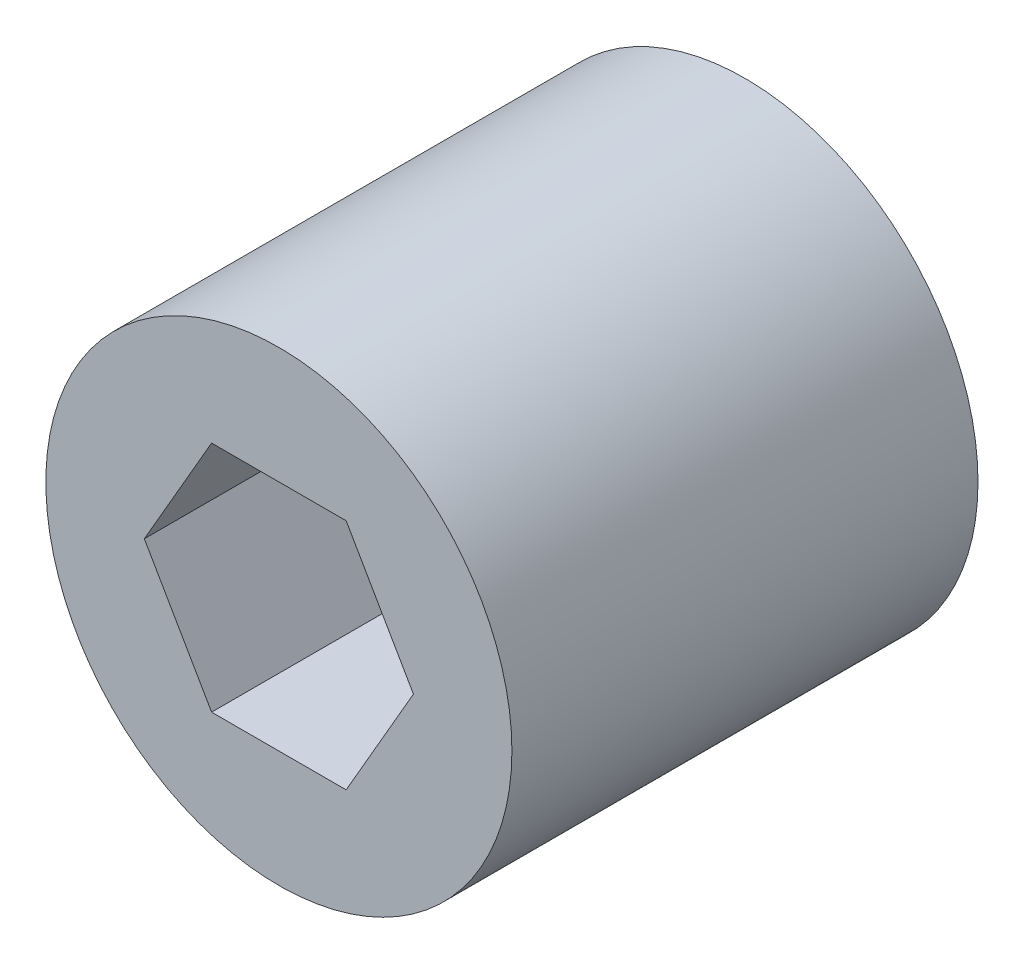
ISO-10303-21;
HEADER;
FILE_DESCRIPTION(('STEP AP214'),'2;1');
FILE_NAME('part.step','',(''),(''),'','','');
FILE_SCHEMA(('AUTOMOTIVE_DESIGN { 1 0 10303 214 1 1 1 1 }'));
ENDSEC;
DATA;
#1=APPLICATION_CONTEXT('core data for automotive mechanical design processes');
#2=APPLICATION_PROTOCOL_DEFINITION('international standard','automotive_design',2000,#1);
#3=PRODUCT_CONTEXT('',#1,'mechanical');
#4=PRODUCT('Part','Part','',(#3));
#5=PRODUCT_RELATED_PRODUCT_CATEGORY('part','',(#4));
#6=PRODUCT_DEFINITION_FORMATION('','',#4);
#7=PRODUCT_DEFINITION_CONTEXT('part definition',#1,'design');
#8=PRODUCT_DEFINITION('design','',#6,#7);
#9=PRODUCT_DEFINITION_SHAPE('','',#8);
#10=(LENGTH_UNIT() NAMED_UNIT(*) SI_UNIT(.MILLI.,.METRE.));
#11=(NAMED_UNIT(*) PLANE_ANGLE_UNIT() SI_UNIT($,.RADIAN.));
#12=(NAMED_UNIT(*) SI_UNIT($,.STERADIAN.) SOLID_ANGLE_UNIT());
#13=UNCERTAINTY_MEASURE_WITH_UNIT(LENGTH_MEASURE(1.E-05),#10,'distance_accuracy_value','');
#14=(GEOMETRIC_REPRESENTATION_CONTEXT(3) GLOBAL_UNCERTAINTY_ASSIGNED_CONTEXT((#13)) GLOBAL_UNIT_ASSIGNED_CONTEXT((#10,
#11,#12)) REPRESENTATION_CONTEXT('',''));
#15=CARTESIAN_POINT('',(0.,0.,0.));
#16=DIRECTION('',(0.,0.,1.));
#17=DIRECTION('',(1.,0.,0.));
#18=AXIS2_PLACEMENT_3D('',#15,#16,#17);
#19=CARTESIAN_POINT('',(0.,0.,25.4));
#20=DIRECTION('',(0.,0.,1.));
#21=DIRECTION('',(1.,0.,0.));
#22=AXIS2_PLACEMENT_3D('',#19,#20,#21);
#23=PLANE('',#22);
#24=CARTESIAN_POINT('',(0.,0.,25.4));
#25=DIRECTION('',(0.,0.,1.));
#26=DIRECTION('',(1.,0.,0.));
#27=AXIS2_PLACEMENT_3D('',#24,#25,#26);
#28=CIRCLE('',#27,12.7);
#29=CARTESIAN_POINT('',(12.7,0.,25.4));
#30=VERTEX_POINT('',#29);
#31=EDGE_CURVE('E11',#30,#30,#28,.T.);
#32=ORIENTED_EDGE('',*,*,#31,.T.);
#33=EDGE_LOOP('',(#32));
#34=FACE_BOUND('',#33,.T.);
#35=DIRECTION('',(0.500000000000001,-0.866025403784438,0.));
#36=VECTOR('',#35,1.);
#37=CARTESIAN_POINT('',(-7.33234841870825,0.,25.4));
#38=LINE('',#37,#36);
#39=CARTESIAN_POINT('',(-7.33234841870825,0.,25.4));
#40=VERTEX_POINT('',#39);
#41=CARTESIAN_POINT('',(-3.66617420935411,-6.35000000000001,25.4));
#42=VERTEX_POINT('',#41);
#43=EDGE_CURVE('E93',#40,#42,#38,.T.);
#44=ORIENTED_EDGE('',*,*,#43,.F.);
#45=DIRECTION('',(-0.499999999999995,-0.866025403784442,0.));
#46=VECTOR('',#45,1.);
#47=CARTESIAN_POINT('',(-3.6661742093542,6.34999999999996,25.4));
#48=LINE('',#47,#46);
#49=CARTESIAN_POINT('',(-3.6661742093542,6.34999999999996,25.4));
#50=VERTEX_POINT('',#49);
#51=EDGE_CURVE('E85',#50,#40,#48,.T.);
#52=ORIENTED_EDGE('',*,*,#51,.F.);
#53=DIRECTION('',(-1.,0.,0.));
#54=VECTOR('',#53,1.);
#55=CARTESIAN_POINT('',(3.66617420935407,6.35000000000004,25.4));
#56=LINE('',#55,#54);
#57=CARTESIAN_POINT('',(3.66617420935407,6.35000000000004,25.4));
#58=VERTEX_POINT('',#57);
#59=EDGE_CURVE('E113',#58,#50,#56,.T.);
#60=ORIENTED_EDGE('',*,*,#59,.F.);
#61=DIRECTION('',(-0.500000000000007,0.866025403784435,0.));
#62=VECTOR('',#61,1.);
#63=CARTESIAN_POINT('',(7.33234841870825,0.,25.4));
#64=LINE('',#63,#62);
#65=CARTESIAN_POINT('',(7.33234841870825,0.,25.4));
#66=VERTEX_POINT('',#65);
#67=EDGE_CURVE('E111',#66,#58,#64,.T.);
#68=ORIENTED_EDGE('',*,*,#67,.F.);
#69=DIRECTION('',(0.499999999999995,0.866025403784442,0.));
#70=VECTOR('',#69,1.);
#71=CARTESIAN_POINT('',(3.66617420935416,-6.34999999999999,25.4));
#72=LINE('',#71,#70);
#73=CARTESIAN_POINT('',(3.66617420935416,-6.34999999999999,25.4));
#74=VERTEX_POINT('',#73);
#75=EDGE_CURVE('E107',#74,#66,#72,.T.);
#76=ORIENTED_EDGE('',*,*,#75,.F.);
#77=DIRECTION('',(1.,0.,0.));
#78=VECTOR('',#77,1.);
#79=CARTESIAN_POINT('',(-3.66617420935411,-6.35000000000001,25.4));
#80=LINE('',#79,#78);
#81=EDGE_CURVE('E105',#42,#74,#80,.T.);
#82=ORIENTED_EDGE('',*,*,#81,.F.);
#83=EDGE_LOOP('',(#44,#52,#60,#68,#76,#82));
#84=FACE_BOUND('',#83,.T.);
#85=ADVANCED_FACE('F32',(#34,#84),#23,.T.);
#86=CARTESIAN_POINT('',(0.,0.,0.));
#87=DIRECTION('',(0.,0.,1.));
#88=DIRECTION('',(1.,0.,0.));
#89=AXIS2_PLACEMENT_3D('',#86,#87,#88);
#90=PLANE('',#89);
#91=CARTESIAN_POINT('',(0.,0.,0.));
#92=DIRECTION('',(0.,0.,1.));
#93=DIRECTION('',(1.,0.,0.));
#94=AXIS2_PLACEMENT_3D('',#91,#92,#93);
#95=CIRCLE('',#94,12.7);
#96=CARTESIAN_POINT('',(12.7,0.,0.));
#97=VERTEX_POINT('',#96);
#98=EDGE_CURVE('E36',#97,#97,#95,.T.);
#99=ORIENTED_EDGE('',*,*,#98,.F.);
#100=EDGE_LOOP('',(#99));
#101=FACE_BOUND('',#100,.T.);
#102=DIRECTION('',(-0.499999999999995,-0.866025403784442,0.));
#103=VECTOR('',#102,1.);
#104=CARTESIAN_POINT('',(-3.6661742093542,6.34999999999996,0.));
#105=LINE('',#104,#103);
#106=CARTESIAN_POINT('',(-3.6661742093542,6.34999999999996,0.));
#107=VERTEX_POINT('',#106);
#108=CARTESIAN_POINT('',(-7.33234841870825,0.,0.));
#109=VERTEX_POINT('',#108);
#110=EDGE_CURVE('E55',#107,#109,#105,.T.);
#111=ORIENTED_EDGE('',*,*,#110,.T.);
#112=DIRECTION('',(0.500000000000001,-0.866025403784438,0.));
#113=VECTOR('',#112,1.);
#114=CARTESIAN_POINT('',(-7.33234841870825,0.,0.));
#115=LINE('',#114,#113);
#116=CARTESIAN_POINT('',(-3.66617420935411,-6.35000000000001,0.));
#117=VERTEX_POINT('',#116);
#118=EDGE_CURVE('E100',#109,#117,#115,.T.);
#119=ORIENTED_EDGE('',*,*,#118,.T.);
#120=DIRECTION('',(1.,0.,0.));
#121=VECTOR('',#120,1.);
#122=CARTESIAN_POINT('',(-3.66617420935411,-6.35000000000001,0.));
#123=LINE('',#122,#121);
#124=CARTESIAN_POINT('',(3.66617420935416,-6.34999999999999,0.));
#125=VERTEX_POINT('',#124);
#126=EDGE_CURVE('E117',#117,#125,#123,.T.);
#127=ORIENTED_EDGE('',*,*,#126,.T.);
#128=DIRECTION('',(0.499999999999995,0.866025403784442,0.));
#129=VECTOR('',#128,1.);
#130=CARTESIAN_POINT('',(3.66617420935416,-6.34999999999999,0.));
#131=LINE('',#130,#129);
#132=CARTESIAN_POINT('',(7.33234841870825,0.,0.));
#133=VERTEX_POINT('',#132);
#134=EDGE_CURVE('E120',#125,#133,#131,.T.);
#135=ORIENTED_EDGE('',*,*,#134,.T.);
#136=DIRECTION('',(-0.500000000000007,0.866025403784435,0.));
#137=VECTOR('',#136,1.);
#138=CARTESIAN_POINT('',(7.33234841870825,0.,0.));
#139=LINE('',#138,#137);
#140=CARTESIAN_POINT('',(3.66617420935407,6.35000000000004,0.));
#141=VERTEX_POINT('',#140);
#142=EDGE_CURVE('E123',#133,#141,#139,.T.);
#143=ORIENTED_EDGE('',*,*,#142,.T.);
#144=DIRECTION('',(-1.,0.,0.));
#145=VECTOR('',#144,1.);
#146=CARTESIAN_POINT('',(3.66617420935407,6.35000000000004,0.));
#147=LINE('',#146,#145);
#148=EDGE_CURVE('E94',#141,#107,#147,.T.);
#149=ORIENTED_EDGE('',*,*,#148,.T.);
#150=EDGE_LOOP('',(#111,#119,#127,#135,#143,#149));
#151=FACE_BOUND('',#150,.T.);
#152=ADVANCED_FACE('F140',(#101,#151),#90,.F.);
#153=CARTESIAN_POINT('',(0.,0.,25.4));
#154=DIRECTION('',(0.,0.,-1.));
#155=DIRECTION('',(-1.,0.,0.));
#156=AXIS2_PLACEMENT_3D('',#153,#154,#155);
#157=CYLINDRICAL_SURFACE('',#156,12.7);
#158=ORIENTED_EDGE('',*,*,#31,.F.);
#159=EDGE_LOOP('',(#158));
#160=FACE_BOUND('',#159,.T.);
#161=ORIENTED_EDGE('',*,*,#98,.T.);
#162=EDGE_LOOP('',(#161));
#163=FACE_BOUND('',#162,.T.);
#164=ADVANCED_FACE('F34',(#160,#163),#157,.T.);
#165=CARTESIAN_POINT('',(-3.6661742093542,6.34999999999996,25.4));
#166=DIRECTION('',(0.866025403784441,-0.499999999999995,0.));
#167=DIRECTION('',(0.499999999999995,0.866025403784442,0.));
#168=AXIS2_PLACEMENT_3D('',#165,#166,#167);
#169=PLANE('',#168);
#170=ORIENTED_EDGE('',*,*,#110,.F.);
#171=DIRECTION('',(0.,0.,-1.));
#172=VECTOR('',#171,1.);
#173=CARTESIAN_POINT('',(-3.6661742093542,6.34999999999996,25.4));
#174=LINE('',#173,#172);
#175=EDGE_CURVE('E89',#50,#107,#174,.T.);
#176=ORIENTED_EDGE('',*,*,#175,.F.);
#177=ORIENTED_EDGE('',*,*,#51,.T.);
#178=DIRECTION('',(0.,0.,-1.));
#179=VECTOR('',#178,1.);
#180=CARTESIAN_POINT('',(-7.33234841870825,0.,25.4));
#181=LINE('',#180,#179);
#182=EDGE_CURVE('E88',#40,#109,#181,.T.);
#183=ORIENTED_EDGE('',*,*,#182,.T.);
#184=EDGE_LOOP('',(#170,#176,#177,#183));
#185=FACE_BOUND('',#184,.T.);
#186=ADVANCED_FACE('F87',(#185),#169,.T.);
#187=CARTESIAN_POINT('',(-7.33234841870825,0.,25.4));
#188=DIRECTION('',(0.866025403784438,0.500000000000001,0.));
#189=DIRECTION('',(-0.500000000000001,0.866025403784438,0.));
#190=AXIS2_PLACEMENT_3D('',#187,#188,#189);
#191=PLANE('',#190);
#192=ORIENTED_EDGE('',*,*,#118,.F.);
#193=ORIENTED_EDGE('',*,*,#182,.F.);
#194=ORIENTED_EDGE('',*,*,#43,.T.);
#195=DIRECTION('',(0.,0.,-1.));
#196=VECTOR('',#195,1.);
#197=CARTESIAN_POINT('',(-3.66617420935411,-6.35000000000001,25.4));
#198=LINE('',#197,#196);
#199=EDGE_CURVE('E101',#42,#117,#198,.T.);
#200=ORIENTED_EDGE('',*,*,#199,.T.);
#201=EDGE_LOOP('',(#192,#193,#194,#200));
#202=FACE_BOUND('',#201,.T.);
#203=ADVANCED_FACE('F97',(#202),#191,.T.);
#204=CARTESIAN_POINT('',(-3.66617420935411,-6.35000000000001,25.4));
#205=DIRECTION('',(0.,1.,0.));
#206=DIRECTION('',(-1.,0.,0.));
#207=AXIS2_PLACEMENT_3D('',#204,#205,#206);
#208=PLANE('',#207);
#209=ORIENTED_EDGE('',*,*,#126,.F.);
#210=ORIENTED_EDGE('',*,*,#199,.F.);
#211=ORIENTED_EDGE('',*,*,#81,.T.);
#212=DIRECTION('',(0.,0.,-1.));
#213=VECTOR('',#212,1.);
#214=CARTESIAN_POINT('',(3.66617420935416,-6.34999999999999,25.4));
#215=LINE('',#214,#213);
#216=EDGE_CURVE('E132',#74,#125,#215,.T.);
#217=ORIENTED_EDGE('',*,*,#216,.T.);
#218=EDGE_LOOP('',(#209,#210,#211,#217));
#219=FACE_BOUND('',#218,.T.);
#220=ADVANCED_FACE('F136',(#219),#208,.T.);
#221=CARTESIAN_POINT('',(3.66617420935416,-6.34999999999999,25.4));
#222=DIRECTION('',(-0.866025403784442,0.499999999999995,0.));
#223=DIRECTION('',(-0.499999999999995,-0.866025403784442,0.));
#224=AXIS2_PLACEMENT_3D('',#221,#222,#223);
#225=PLANE('',#224);
#226=ORIENTED_EDGE('',*,*,#134,.F.);
#227=ORIENTED_EDGE('',*,*,#216,.F.);
#228=ORIENTED_EDGE('',*,*,#75,.T.);
#229=DIRECTION('',(0.,0.,-1.));
#230=VECTOR('',#229,1.);
#231=CARTESIAN_POINT('',(7.33234841870825,0.,25.4));
#232=LINE('',#231,#230);
#233=EDGE_CURVE('E130',#66,#133,#232,.T.);
#234=ORIENTED_EDGE('',*,*,#233,.T.);
#235=EDGE_LOOP('',(#226,#227,#228,#234));
#236=FACE_BOUND('',#235,.T.);
#237=ADVANCED_FACE('F148',(#236),#225,.T.);
#238=CARTESIAN_POINT('',(7.33234841870825,0.,25.4));
#239=DIRECTION('',(-0.866025403784435,-0.500000000000007,0.));
#240=DIRECTION('',(0.500000000000007,-0.866025403784435,0.));
#241=AXIS2_PLACEMENT_3D('',#238,#239,#240);
#242=PLANE('',#241);
#243=ORIENTED_EDGE('',*,*,#142,.F.);
#244=ORIENTED_EDGE('',*,*,#233,.F.);
#245=ORIENTED_EDGE('',*,*,#67,.T.);
#246=DIRECTION('',(0.,0.,-1.));
#247=VECTOR('',#246,1.);
#248=CARTESIAN_POINT('',(3.66617420935407,6.35000000000004,25.4));
#249=LINE('',#248,#247);
#250=EDGE_CURVE('E47',#58,#141,#249,.T.);
#251=ORIENTED_EDGE('',*,*,#250,.T.);
#252=EDGE_LOOP('',(#243,#244,#245,#251));
#253=FACE_BOUND('',#252,.T.);
#254=ADVANCED_FACE('F146',(#253),#242,.T.);
#255=CARTESIAN_POINT('',(3.66617420935407,6.35000000000004,25.4));
#256=DIRECTION('',(0.,-1.,0.));
#257=DIRECTION('',(1.,0.,0.));
#258=AXIS2_PLACEMENT_3D('',#255,#256,#257);
#259=PLANE('',#258);
#260=ORIENTED_EDGE('',*,*,#148,.F.);
#261=ORIENTED_EDGE('',*,*,#250,.F.);
#262=ORIENTED_EDGE('',*,*,#59,.T.);
#263=ORIENTED_EDGE('',*,*,#175,.T.);
#264=EDGE_LOOP('',(#260,#261,#262,#263));
#265=FACE_BOUND('',#264,.T.);
#266=ADVANCED_FACE('F142',(#265),#259,.T.);
#267=CLOSED_SHELL('',(#85,#152,#164,#186,#203,#220,#237,#254,#266));
#268=MANIFOLD_SOLID_BREP('B2',#267);
#269=ADVANCED_BREP_SHAPE_REPRESENTATION('',(#18,#268),#14);
#270=SHAPE_DEFINITION_REPRESENTATION(#9,#269);
ENDSEC;
END-ISO-10303-21;
